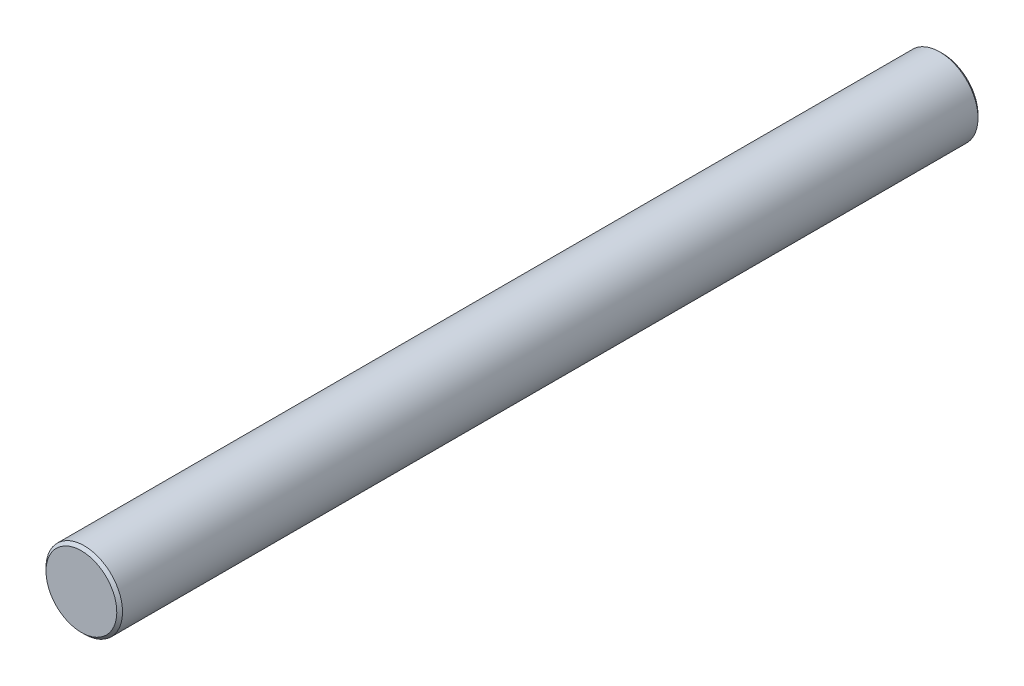
ISO-10303-21;
HEADER;
FILE_DESCRIPTION(('STEP AP214'),'2;1');
FILE_NAME('part.step','',(''),(''),'','','');
FILE_SCHEMA(('AUTOMOTIVE_DESIGN { 1 0 10303 214 1 1 1 1 }'));
ENDSEC;
DATA;
#1=APPLICATION_CONTEXT('core data for automotive mechanical design processes');
#2=APPLICATION_PROTOCOL_DEFINITION('international standard','automotive_design',2000,#1);
#3=PRODUCT_CONTEXT('',#1,'mechanical');
#4=PRODUCT('Part','Part','',(#3));
#5=PRODUCT_RELATED_PRODUCT_CATEGORY('part','',(#4));
#6=PRODUCT_DEFINITION_FORMATION('','',#4);
#7=PRODUCT_DEFINITION_CONTEXT('part definition',#1,'design');
#8=PRODUCT_DEFINITION('design','',#6,#7);
#9=PRODUCT_DEFINITION_SHAPE('','',#8);
#10=(LENGTH_UNIT() NAMED_UNIT(*) SI_UNIT(.MILLI.,.METRE.));
#11=(NAMED_UNIT(*) PLANE_ANGLE_UNIT() SI_UNIT($,.RADIAN.));
#12=(NAMED_UNIT(*) SI_UNIT($,.STERADIAN.) SOLID_ANGLE_UNIT());
#13=UNCERTAINTY_MEASURE_WITH_UNIT(LENGTH_MEASURE(1.E-05),#10,'distance_accuracy_value','');
#14=(GEOMETRIC_REPRESENTATION_CONTEXT(3) GLOBAL_UNCERTAINTY_ASSIGNED_CONTEXT((#13)) GLOBAL_UNIT_ASSIGNED_CONTEXT((#10,
#11,#12)) REPRESENTATION_CONTEXT('',''));
#15=CARTESIAN_POINT('',(0.,0.,0.));
#16=DIRECTION('',(0.,0.,1.));
#17=DIRECTION('',(1.,0.,0.));
#18=AXIS2_PLACEMENT_3D('',#15,#16,#17);
#19=CARTESIAN_POINT('',(0.,9.25,0.));
#20=DIRECTION('',(0.,0.,-1.));
#21=DIRECTION('',(0.,1.,0.));
#22=AXIS2_PLACEMENT_3D('',#19,#20,#21);
#23=PLANE('',#22);
#24=CARTESIAN_POINT('',(0.,0.,0.));
#25=DIRECTION('',(0.,0.,-1.));
#26=DIRECTION('',(0.,1.,0.));
#27=AXIS2_PLACEMENT_3D('',#24,#25,#26);
#28=CIRCLE('',#27,18.5);
#29=CARTESIAN_POINT('',(0.,18.5,0.));
#30=VERTEX_POINT('',#29);
#31=EDGE_CURVE('E9',#30,#30,#28,.T.);
#32=ORIENTED_EDGE('',*,*,#31,.T.);
#33=EDGE_LOOP('',(#32));
#34=FACE_BOUND('',#33,.T.);
#35=CARTESIAN_POINT('',(0.,0.,0.));
#36=DIRECTION('',(0.,0.,1.));
#37=DIRECTION('',(-1.,0.,0.));
#38=AXIS2_PLACEMENT_3D('',#35,#36,#37);
#39=CIRCLE('',#38,6.);
#40=CARTESIAN_POINT('',(-6.,0.,0.));
#41=VERTEX_POINT('',#40);
#42=EDGE_CURVE('E48',#41,#41,#39,.T.);
#43=ORIENTED_EDGE('',*,*,#42,.T.);
#44=EDGE_LOOP('',(#43));
#45=FACE_BOUND('',#44,.T.);
#46=ADVANCED_FACE('F15',(#34,#45),#23,.T.);
#47=CARTESIAN_POINT('',(0.,0.,0.75));
#48=DIRECTION('',(0.,0.,1.));
#49=DIRECTION('',(0.,1.,0.));
#50=AXIS2_PLACEMENT_3D('',#47,#48,#49);
#51=CONICAL_SURFACE('',#50,19.25,0.785398163397448);
#52=CARTESIAN_POINT('',(0.,0.,1.5));
#53=DIRECTION('',(0.,0.,-1.));
#54=DIRECTION('',(0.,1.,0.));
#55=AXIS2_PLACEMENT_3D('',#52,#53,#54);
#56=CIRCLE('',#55,20.);
#57=CARTESIAN_POINT('',(0.,20.,1.5));
#58=VERTEX_POINT('',#57);
#59=EDGE_CURVE('E25',#58,#58,#56,.T.);
#60=ORIENTED_EDGE('',*,*,#59,.T.);
#61=EDGE_LOOP('',(#60));
#62=FACE_BOUND('',#61,.T.);
#63=ORIENTED_EDGE('',*,*,#31,.F.);
#64=EDGE_LOOP('',(#63));
#65=FACE_BOUND('',#64,.T.);
#66=ADVANCED_FACE('F88',(#62,#65),#51,.T.);
#67=CARTESIAN_POINT('',(0.,0.,225.));
#68=DIRECTION('',(0.,0.,1.));
#69=DIRECTION('',(0.,1.,0.));
#70=AXIS2_PLACEMENT_3D('',#67,#68,#69);
#71=CYLINDRICAL_SURFACE('',#70,20.);
#72=CARTESIAN_POINT('',(0.,0.,448.5));
#73=DIRECTION('',(0.,0.,-1.));
#74=DIRECTION('',(0.,1.,0.));
#75=AXIS2_PLACEMENT_3D('',#72,#73,#74);
#76=CIRCLE('',#75,20.);
#77=CARTESIAN_POINT('',(0.,20.,448.5));
#78=VERTEX_POINT('',#77);
#79=EDGE_CURVE('E19',#78,#78,#76,.T.);
#80=ORIENTED_EDGE('',*,*,#79,.T.);
#81=EDGE_LOOP('',(#80));
#82=FACE_BOUND('',#81,.T.);
#83=ORIENTED_EDGE('',*,*,#59,.F.);
#84=EDGE_LOOP('',(#83));
#85=FACE_BOUND('',#84,.T.);
#86=CARTESIAN_POINT('',(0.,0.,6.5));
#87=DIRECTION('',(0.,0.,-1.));
#88=DIRECTION('',(0.,1.,0.));
#89=AXIS2_PLACEMENT_3D('',#86,#87,#88);
#90=CIRCLE('',#89,20.);
#91=CARTESIAN_POINT('',(10.5356537528527,-17.,6.5));
#92=VERTEX_POINT('',#91);
#93=CARTESIAN_POINT('',(-10.5356537528527,-17.,6.5));
#94=VERTEX_POINT('',#93);
#95=EDGE_CURVE('E119',#92,#94,#90,.T.);
#96=ORIENTED_EDGE('',*,*,#95,.T.);
#97=DIRECTION('',(0.,0.,1.));
#98=VECTOR('',#97,1.);
#99=CARTESIAN_POINT('',(-10.5356537528527,-17.,8.25));
#100=LINE('',#99,#98);
#101=CARTESIAN_POINT('',(-10.5356537528527,-17.,10.));
#102=VERTEX_POINT('',#101);
#103=EDGE_CURVE('E128',#94,#102,#100,.T.);
#104=ORIENTED_EDGE('',*,*,#103,.T.);
#105=CARTESIAN_POINT('',(0.,0.,10.));
#106=DIRECTION('',(0.,0.,1.));
#107=DIRECTION('',(0.,1.,0.));
#108=AXIS2_PLACEMENT_3D('',#105,#106,#107);
#109=CIRCLE('',#108,20.);
#110=CARTESIAN_POINT('',(10.5356537528527,-17.,10.));
#111=VERTEX_POINT('',#110);
#112=EDGE_CURVE('E114',#102,#111,#109,.T.);
#113=ORIENTED_EDGE('',*,*,#112,.T.);
#114=DIRECTION('',(0.,0.,-1.));
#115=VECTOR('',#114,1.);
#116=CARTESIAN_POINT('',(10.5356537528527,-17.,8.25));
#117=LINE('',#116,#115);
#118=EDGE_CURVE('E129',#111,#92,#117,.T.);
#119=ORIENTED_EDGE('',*,*,#118,.T.);
#120=EDGE_LOOP('',(#96,#104,#113,#119));
#121=FACE_BOUND('',#120,.T.);
#122=ADVANCED_FACE('F17',(#82,#85,#121),#71,.T.);
#123=CARTESIAN_POINT('',(0.,0.,449.25));
#124=DIRECTION('',(0.,0.,-1.));
#125=DIRECTION('',(0.,1.,0.));
#126=AXIS2_PLACEMENT_3D('',#123,#124,#125);
#127=CONICAL_SURFACE('',#126,19.25,0.785398163397448);
#128=CARTESIAN_POINT('',(0.,0.,450.));
#129=DIRECTION('',(0.,0.,-1.));
#130=DIRECTION('',(0.,1.,0.));
#131=AXIS2_PLACEMENT_3D('',#128,#129,#130);
#132=CIRCLE('',#131,18.5);
#133=CARTESIAN_POINT('',(0.,18.5,450.));
#134=VERTEX_POINT('',#133);
#135=EDGE_CURVE('E132',#134,#134,#132,.T.);
#136=ORIENTED_EDGE('',*,*,#135,.T.);
#137=EDGE_LOOP('',(#136));
#138=FACE_BOUND('',#137,.T.);
#139=ORIENTED_EDGE('',*,*,#79,.F.);
#140=EDGE_LOOP('',(#139));
#141=FACE_BOUND('',#140,.T.);
#142=ADVANCED_FACE('F83',(#138,#141),#127,.T.);
#143=CARTESIAN_POINT('',(0.,9.25,450.));
#144=DIRECTION('',(0.,0.,1.));
#145=DIRECTION('',(0.,-1.,0.));
#146=AXIS2_PLACEMENT_3D('',#143,#144,#145);
#147=PLANE('',#146);
#148=ORIENTED_EDGE('',*,*,#135,.F.);
#149=EDGE_LOOP('',(#148));
#150=FACE_BOUND('',#149,.T.);
#151=ADVANCED_FACE('F72',(#150),#147,.T.);
#152=CARTESIAN_POINT('',(0.,0.,26.4586213285198));
#153=DIRECTION('',(0.,0.,-1.));
#154=DIRECTION('',(-1.,0.,0.));
#155=AXIS2_PLACEMENT_3D('',#152,#153,#154);
#156=CONICAL_SURFACE('',#155,2.52640625,1.0471975511966);
#157=CARTESIAN_POINT('',(0.,0.,25.));
#158=DIRECTION('',(0.,0.,1.));
#159=DIRECTION('',(-1.,0.,0.));
#160=AXIS2_PLACEMENT_3D('',#157,#158,#159);
#161=CIRCLE('',#160,5.0528125);
#162=CARTESIAN_POINT('',(-5.0528125,0.,25.));
#163=VERTEX_POINT('',#162);
#164=EDGE_CURVE('E41',#163,#163,#161,.T.);
#165=ORIENTED_EDGE('',*,*,#164,.F.);
#166=EDGE_LOOP('',(#165));
#167=FACE_BOUND('',#166,.T.);
#168=CARTESIAN_POINT('',(0.,0.,27.9172426570397));
#169=VERTEX_POINT('',#168);
#170=VERTEX_LOOP('',#169);
#171=FACE_BOUND('',#170,.T.);
#172=ADVANCED_FACE('F69',(#167,#171),#156,.F.);
#173=CARTESIAN_POINT('',(0.,0.,12.97359375));
#174=DIRECTION('',(0.,0.,-1.));
#175=DIRECTION('',(-1.,0.,0.));
#176=AXIS2_PLACEMENT_3D('',#173,#174,#175);
#177=CYLINDRICAL_SURFACE('',#176,5.0528125);
#178=CARTESIAN_POINT('',(0.,0.,0.9471875));
#179=DIRECTION('',(0.,0.,1.));
#180=DIRECTION('',(-1.,0.,0.));
#181=AXIS2_PLACEMENT_3D('',#178,#179,#180);
#182=CIRCLE('',#181,5.0528125);
#183=CARTESIAN_POINT('',(-5.0528125,0.,0.9471875));
#184=VERTEX_POINT('',#183);
#185=EDGE_CURVE('E53',#184,#184,#182,.T.);
#186=ORIENTED_EDGE('',*,*,#185,.F.);
#187=EDGE_LOOP('',(#186));
#188=FACE_BOUND('',#187,.T.);
#189=ORIENTED_EDGE('',*,*,#164,.T.);
#190=EDGE_LOOP('',(#189));
#191=FACE_BOUND('',#190,.T.);
#192=ADVANCED_FACE('F71',(#188,#191),#177,.F.);
#193=CARTESIAN_POINT('',(0.,0.,0.47359375));
#194=DIRECTION('',(0.,0.,-1.));
#195=DIRECTION('',(-1.,0.,0.));
#196=AXIS2_PLACEMENT_3D('',#193,#194,#195);
#197=CONICAL_SURFACE('',#196,5.52640625,0.785398163397448);
#198=ORIENTED_EDGE('',*,*,#42,.F.);
#199=EDGE_LOOP('',(#198));
#200=FACE_BOUND('',#199,.T.);
#201=ORIENTED_EDGE('',*,*,#185,.T.);
#202=EDGE_LOOP('',(#201));
#203=FACE_BOUND('',#202,.T.);
#204=ADVANCED_FACE('F80',(#200,#203),#197,.F.);
#205=CARTESIAN_POINT('',(0.,-17.,8.25));
#206=DIRECTION('',(0.,-1.,0.));
#207=DIRECTION('',(0.,0.,-1.));
#208=AXIS2_PLACEMENT_3D('',#205,#206,#207);
#209=PLANE('',#208);
#210=ORIENTED_EDGE('',*,*,#103,.F.);
#211=DIRECTION('',(1.,0.,0.));
#212=VECTOR('',#211,1.);
#213=CARTESIAN_POINT('',(0.,-17.,6.5));
#214=LINE('',#213,#212);
#215=EDGE_CURVE('E124',#94,#92,#214,.T.);
#216=ORIENTED_EDGE('',*,*,#215,.T.);
#217=ORIENTED_EDGE('',*,*,#118,.F.);
#218=DIRECTION('',(-1.,0.,0.));
#219=VECTOR('',#218,1.);
#220=CARTESIAN_POINT('',(0.,-17.,10.));
#221=LINE('',#220,#219);
#222=EDGE_CURVE('E116',#111,#102,#221,.T.);
#223=ORIENTED_EDGE('',*,*,#222,.T.);
#224=EDGE_LOOP('',(#210,#216,#217,#223));
#225=FACE_BOUND('',#224,.T.);
#226=ADVANCED_FACE('F97',(#225),#209,.T.);
#227=CARTESIAN_POINT('',(0.,-19.5,6.5));
#228=DIRECTION('',(0.,0.,1.));
#229=DIRECTION('',(1.,0.,0.));
#230=AXIS2_PLACEMENT_3D('',#227,#228,#229);
#231=PLANE('',#230);
#232=ORIENTED_EDGE('',*,*,#95,.F.);
#233=ORIENTED_EDGE('',*,*,#215,.F.);
#234=EDGE_LOOP('',(#232,#233));
#235=FACE_BOUND('',#234,.T.);
#236=ADVANCED_FACE('F101',(#235),#231,.T.);
#237=CARTESIAN_POINT('',(0.,-19.5,10.));
#238=DIRECTION('',(0.,0.,1.));
#239=DIRECTION('',(1.,0.,0.));
#240=AXIS2_PLACEMENT_3D('',#237,#238,#239);
#241=PLANE('',#240);
#242=ORIENTED_EDGE('',*,*,#112,.F.);
#243=ORIENTED_EDGE('',*,*,#222,.F.);
#244=EDGE_LOOP('',(#242,#243));
#245=FACE_BOUND('',#244,.T.);
#246=ADVANCED_FACE('F105',(#245),#241,.F.);
#247=CLOSED_SHELL('',(#46,#66,#122,#142,#151,#172,#192,#204,#226,#236,#246));
#248=MANIFOLD_SOLID_BREP('B1',#247);
#249=ADVANCED_BREP_SHAPE_REPRESENTATION('',(#18,#248),#14);
#250=SHAPE_DEFINITION_REPRESENTATION(#9,#249);
ENDSEC;
END-ISO-10303-21;
